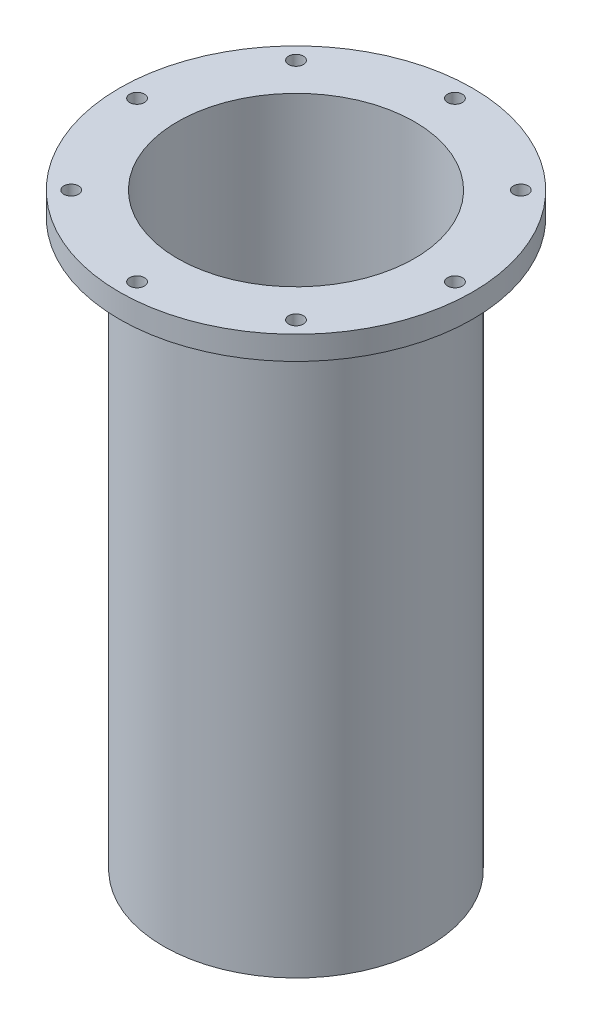
ISO-10303-21;
HEADER;
FILE_DESCRIPTION(('STEP AP214'),'2;1');
FILE_NAME('part.step','',(''),(''),'','','');
FILE_SCHEMA(('AUTOMOTIVE_DESIGN { 1 0 10303 214 1 1 1 1 }'));
ENDSEC;
DATA;
#1=APPLICATION_CONTEXT('core data for automotive mechanical design processes');
#2=APPLICATION_PROTOCOL_DEFINITION('international standard','automotive_design',2000,#1);
#3=PRODUCT_CONTEXT('',#1,'mechanical');
#4=PRODUCT('Part','Part','',(#3));
#5=PRODUCT_RELATED_PRODUCT_CATEGORY('part','',(#4));
#6=PRODUCT_DEFINITION_FORMATION('','',#4);
#7=PRODUCT_DEFINITION_CONTEXT('part definition',#1,'design');
#8=PRODUCT_DEFINITION('design','',#6,#7);
#9=PRODUCT_DEFINITION_SHAPE('','',#8);
#10=(LENGTH_UNIT() NAMED_UNIT(*) SI_UNIT(.MILLI.,.METRE.));
#11=(NAMED_UNIT(*) PLANE_ANGLE_UNIT() SI_UNIT($,.RADIAN.));
#12=(NAMED_UNIT(*) SI_UNIT($,.STERADIAN.) SOLID_ANGLE_UNIT());
#13=UNCERTAINTY_MEASURE_WITH_UNIT(LENGTH_MEASURE(1.E-05),#10,'distance_accuracy_value','');
#14=(GEOMETRIC_REPRESENTATION_CONTEXT(3) GLOBAL_UNCERTAINTY_ASSIGNED_CONTEXT((#13)) GLOBAL_UNIT_ASSIGNED_CONTEXT((#10,
#11,#12)) REPRESENTATION_CONTEXT('',''));
#15=CARTESIAN_POINT('',(0.,0.,0.));
#16=DIRECTION('',(0.,0.,1.));
#17=DIRECTION('',(1.,0.,0.));
#18=AXIS2_PLACEMENT_3D('',#15,#16,#17);
#19=CARTESIAN_POINT('',(51.1302,0.,0.));
#20=DIRECTION('',(0.,1.,0.));
#21=DIRECTION('',(0.,0.,1.));
#22=AXIS2_PLACEMENT_3D('',#19,#20,#21);
#23=PLANE('',#22);
#24=CARTESIAN_POINT('',(0.,0.,0.));
#25=DIRECTION('',(0.,1.,0.));
#26=DIRECTION('',(0.,0.,1.));
#27=AXIS2_PLACEMENT_3D('',#24,#25,#26);
#28=CIRCLE('',#27,57.15);
#29=CARTESIAN_POINT('',(0.,0.,57.15));
#30=VERTEX_POINT('',#29);
#31=EDGE_CURVE('E10',#30,#30,#28,.T.);
#32=ORIENTED_EDGE('',*,*,#31,.F.);
#33=EDGE_LOOP('',(#32));
#34=FACE_BOUND('',#33,.T.);
#35=CARTESIAN_POINT('',(0.,0.,0.));
#36=DIRECTION('',(0.,1.,0.));
#37=DIRECTION('',(0.,0.,1.));
#38=AXIS2_PLACEMENT_3D('',#35,#36,#37);
#39=CIRCLE('',#38,51.1302);
#40=CARTESIAN_POINT('',(0.,0.,51.1302));
#41=VERTEX_POINT('',#40);
#42=EDGE_CURVE('E58',#41,#41,#39,.T.);
#43=ORIENTED_EDGE('',*,*,#42,.T.);
#44=EDGE_LOOP('',(#43));
#45=FACE_BOUND('',#44,.T.);
#46=ADVANCED_FACE('F36',(#34,#45),#23,.F.);
#47=CARTESIAN_POINT('',(0.,0.,0.));
#48=DIRECTION('',(0.,1.,0.));
#49=DIRECTION('',(0.,0.,1.));
#50=AXIS2_PLACEMENT_3D('',#47,#48,#49);
#51=CYLINDRICAL_SURFACE('',#50,57.15);
#52=CARTESIAN_POINT('',(0.,243.84,0.));
#53=DIRECTION('',(0.,1.,0.));
#54=DIRECTION('',(0.,0.,1.));
#55=AXIS2_PLACEMENT_3D('',#52,#53,#54);
#56=CIRCLE('',#55,57.15);
#57=CARTESIAN_POINT('',(0.,243.84,57.15));
#58=VERTEX_POINT('',#57);
#59=EDGE_CURVE('E42',#58,#58,#56,.T.);
#60=ORIENTED_EDGE('',*,*,#59,.F.);
#61=EDGE_LOOP('',(#60));
#62=FACE_BOUND('',#61,.T.);
#63=ORIENTED_EDGE('',*,*,#31,.T.);
#64=EDGE_LOOP('',(#63));
#65=FACE_BOUND('',#64,.T.);
#66=ADVANCED_FACE('F144',(#62,#65),#51,.T.);
#67=CARTESIAN_POINT('',(57.15,243.84,0.));
#68=DIRECTION('',(0.,1.,0.));
#69=DIRECTION('',(0.,0.,1.));
#70=AXIS2_PLACEMENT_3D('',#67,#68,#69);
#71=PLANE('',#70);
#72=CARTESIAN_POINT('',(0.,243.84,-68.58));
#73=DIRECTION('',(0.,1.,0.));
#74=DIRECTION('',(0.,0.,1.));
#75=AXIS2_PLACEMENT_3D('',#72,#73,#74);
#76=CIRCLE('',#75,3.175);
#77=CARTESIAN_POINT('',(0.,243.84,-65.405));
#78=VERTEX_POINT('',#77);
#79=EDGE_CURVE('E61',#78,#78,#76,.T.);
#80=ORIENTED_EDGE('',*,*,#79,.T.);
#81=EDGE_LOOP('',(#80));
#82=FACE_BOUND('',#81,.T.);
#83=CARTESIAN_POINT('',(48.4933830537742,243.84,-48.4933830537727));
#84=DIRECTION('',(0.,1.,0.));
#85=DIRECTION('',(0.,0.,1.));
#86=AXIS2_PLACEMENT_3D('',#83,#84,#85);
#87=CIRCLE('',#86,3.17500000000001);
#88=CARTESIAN_POINT('',(48.4933830537742,243.84,-45.3183830537727));
#89=VERTEX_POINT('',#88);
#90=EDGE_CURVE('E64',#89,#89,#87,.T.);
#91=ORIENTED_EDGE('',*,*,#90,.T.);
#92=EDGE_LOOP('',(#91));
#93=FACE_BOUND('',#92,.T.);
#94=CARTESIAN_POINT('',(68.58,243.84,1.1518563880486E-12));
#95=DIRECTION('',(0.,1.,0.));
#96=DIRECTION('',(0.,0.,1.));
#97=AXIS2_PLACEMENT_3D('',#94,#95,#96);
#98=CIRCLE('',#97,3.17500000000001);
#99=CARTESIAN_POINT('',(68.58,243.84,3.17500000000116));
#100=VERTEX_POINT('',#99);
#101=EDGE_CURVE('E67',#100,#100,#98,.T.);
#102=ORIENTED_EDGE('',*,*,#101,.T.);
#103=EDGE_LOOP('',(#102));
#104=FACE_BOUND('',#103,.T.);
#105=CARTESIAN_POINT('',(48.4933830537725,243.84,48.4933830537744));
#106=DIRECTION('',(0.,1.,0.));
#107=DIRECTION('',(0.,0.,1.));
#108=AXIS2_PLACEMENT_3D('',#105,#106,#107);
#109=CIRCLE('',#108,3.175);
#110=CARTESIAN_POINT('',(48.4933830537725,243.84,51.6683830537744));
#111=VERTEX_POINT('',#110);
#112=EDGE_CURVE('E70',#111,#111,#109,.T.);
#113=ORIENTED_EDGE('',*,*,#112,.T.);
#114=EDGE_LOOP('',(#113));
#115=FACE_BOUND('',#114,.T.);
#116=CARTESIAN_POINT('',(-1.39471767468535E-12,243.84,68.58));
#117=DIRECTION('',(0.,1.,0.));
#118=DIRECTION('',(0.,0.,1.));
#119=AXIS2_PLACEMENT_3D('',#116,#117,#118);
#120=CIRCLE('',#119,3.17499999999999);
#121=CARTESIAN_POINT('',(-1.39471767468535E-12,243.84,71.755));
#122=VERTEX_POINT('',#121);
#123=EDGE_CURVE('E73',#122,#122,#120,.T.);
#124=ORIENTED_EDGE('',*,*,#123,.T.);
#125=EDGE_LOOP('',(#124));
#126=FACE_BOUND('',#125,.T.);
#127=CARTESIAN_POINT('',(-48.4933830537738,243.84,48.493383053773));
#128=DIRECTION('',(0.,1.,0.));
#129=DIRECTION('',(0.,0.,1.));
#130=AXIS2_PLACEMENT_3D('',#127,#128,#129);
#131=CIRCLE('',#130,3.17499999999999);
#132=CARTESIAN_POINT('',(-48.4933830537738,243.84,51.668383053773));
#133=VERTEX_POINT('',#132);
#134=EDGE_CURVE('E76',#133,#133,#131,.T.);
#135=ORIENTED_EDGE('',*,*,#134,.T.);
#136=EDGE_LOOP('',(#135));
#137=FACE_BOUND('',#136,.T.);
#138=CARTESIAN_POINT('',(-68.58,243.84,-6.93889390390723E-13));
#139=DIRECTION('',(0.,1.,0.));
#140=DIRECTION('',(0.,0.,1.));
#141=AXIS2_PLACEMENT_3D('',#138,#139,#140);
#142=CIRCLE('',#141,3.175);
#143=CARTESIAN_POINT('',(-68.58,243.84,3.17499999999931));
#144=VERTEX_POINT('',#143);
#145=EDGE_CURVE('E79',#144,#144,#142,.T.);
#146=ORIENTED_EDGE('',*,*,#145,.T.);
#147=EDGE_LOOP('',(#146));
#148=FACE_BOUND('',#147,.T.);
#149=CARTESIAN_POINT('',(-48.4933830537728,243.84,-48.493383053774));
#150=DIRECTION('',(0.,1.,0.));
#151=DIRECTION('',(0.,0.,1.));
#152=AXIS2_PLACEMENT_3D('',#149,#150,#151);
#153=CIRCLE('',#152,3.17499999999999);
#154=CARTESIAN_POINT('',(-48.4933830537728,243.84,-45.318383053774));
#155=VERTEX_POINT('',#154);
#156=EDGE_CURVE('E82',#155,#155,#153,.T.);
#157=ORIENTED_EDGE('',*,*,#156,.T.);
#158=EDGE_LOOP('',(#157));
#159=FACE_BOUND('',#158,.T.);
#160=CARTESIAN_POINT('',(0.,243.84,0.));
#161=DIRECTION('',(0.,1.,0.));
#162=DIRECTION('',(0.,0.,1.));
#163=AXIS2_PLACEMENT_3D('',#160,#161,#162);
#164=CIRCLE('',#163,76.2);
#165=CARTESIAN_POINT('',(0.,243.84,76.2));
#166=VERTEX_POINT('',#165);
#167=EDGE_CURVE('E46',#166,#166,#164,.T.);
#168=ORIENTED_EDGE('',*,*,#167,.F.);
#169=EDGE_LOOP('',(#168));
#170=FACE_BOUND('',#169,.T.);
#171=ORIENTED_EDGE('',*,*,#59,.T.);
#172=EDGE_LOOP('',(#171));
#173=FACE_BOUND('',#172,.T.);
#174=ADVANCED_FACE('F139',(#82,#93,#104,#115,#126,#137,#148,#159,#170,#173),#71,.F.);
#175=CARTESIAN_POINT('',(0.,0.,0.));
#176=DIRECTION('',(0.,1.,0.));
#177=DIRECTION('',(0.,0.,1.));
#178=AXIS2_PLACEMENT_3D('',#175,#176,#177);
#179=CYLINDRICAL_SURFACE('',#178,76.2);
#180=CARTESIAN_POINT('',(0.,254.,0.));
#181=DIRECTION('',(0.,1.,0.));
#182=DIRECTION('',(0.,0.,1.));
#183=AXIS2_PLACEMENT_3D('',#180,#181,#182);
#184=CIRCLE('',#183,76.2);
#185=CARTESIAN_POINT('',(0.,254.,76.2));
#186=VERTEX_POINT('',#185);
#187=EDGE_CURVE('E50',#186,#186,#184,.T.);
#188=ORIENTED_EDGE('',*,*,#187,.F.);
#189=EDGE_LOOP('',(#188));
#190=FACE_BOUND('',#189,.T.);
#191=ORIENTED_EDGE('',*,*,#167,.T.);
#192=EDGE_LOOP('',(#191));
#193=FACE_BOUND('',#192,.T.);
#194=ADVANCED_FACE('F117',(#190,#193),#179,.T.);
#195=CARTESIAN_POINT('',(76.2,254.,0.));
#196=DIRECTION('',(0.,-1.,0.));
#197=DIRECTION('',(0.,0.,-1.));
#198=AXIS2_PLACEMENT_3D('',#195,#196,#197);
#199=PLANE('',#198);
#200=CARTESIAN_POINT('',(0.,254.,-68.58));
#201=DIRECTION('',(0.,1.,0.));
#202=DIRECTION('',(0.,0.,1.));
#203=AXIS2_PLACEMENT_3D('',#200,#201,#202);
#204=CIRCLE('',#203,3.175);
#205=CARTESIAN_POINT('',(0.,254.,-65.405));
#206=VERTEX_POINT('',#205);
#207=EDGE_CURVE('E85',#206,#206,#204,.T.);
#208=ORIENTED_EDGE('',*,*,#207,.F.);
#209=EDGE_LOOP('',(#208));
#210=FACE_BOUND('',#209,.T.);
#211=CARTESIAN_POINT('',(48.4933830537742,254.,-48.4933830537727));
#212=DIRECTION('',(0.,1.,0.));
#213=DIRECTION('',(0.,0.,1.));
#214=AXIS2_PLACEMENT_3D('',#211,#212,#213);
#215=CIRCLE('',#214,3.17500000000001);
#216=CARTESIAN_POINT('',(48.4933830537742,254.,-45.3183830537727));
#217=VERTEX_POINT('',#216);
#218=EDGE_CURVE('E104',#217,#217,#215,.T.);
#219=ORIENTED_EDGE('',*,*,#218,.F.);
#220=EDGE_LOOP('',(#219));
#221=FACE_BOUND('',#220,.T.);
#222=CARTESIAN_POINT('',(68.58,254.,1.1518563880486E-12));
#223=DIRECTION('',(0.,1.,0.));
#224=DIRECTION('',(0.,0.,1.));
#225=AXIS2_PLACEMENT_3D('',#222,#223,#224);
#226=CIRCLE('',#225,3.17500000000001);
#227=CARTESIAN_POINT('',(68.58,254.,3.17500000000116));
#228=VERTEX_POINT('',#227);
#229=EDGE_CURVE('E101',#228,#228,#226,.T.);
#230=ORIENTED_EDGE('',*,*,#229,.F.);
#231=EDGE_LOOP('',(#230));
#232=FACE_BOUND('',#231,.T.);
#233=CARTESIAN_POINT('',(48.4933830537725,254.,48.4933830537744));
#234=DIRECTION('',(0.,1.,0.));
#235=DIRECTION('',(0.,0.,1.));
#236=AXIS2_PLACEMENT_3D('',#233,#234,#235);
#237=CIRCLE('',#236,3.175);
#238=CARTESIAN_POINT('',(48.4933830537725,254.,51.6683830537744));
#239=VERTEX_POINT('',#238);
#240=EDGE_CURVE('E98',#239,#239,#237,.T.);
#241=ORIENTED_EDGE('',*,*,#240,.F.);
#242=EDGE_LOOP('',(#241));
#243=FACE_BOUND('',#242,.T.);
#244=CARTESIAN_POINT('',(-1.39471767468535E-12,254.,68.58));
#245=DIRECTION('',(0.,1.,0.));
#246=DIRECTION('',(0.,0.,1.));
#247=AXIS2_PLACEMENT_3D('',#244,#245,#246);
#248=CIRCLE('',#247,3.17499999999999);
#249=CARTESIAN_POINT('',(-1.39471767468535E-12,254.,71.755));
#250=VERTEX_POINT('',#249);
#251=EDGE_CURVE('E95',#250,#250,#248,.T.);
#252=ORIENTED_EDGE('',*,*,#251,.F.);
#253=EDGE_LOOP('',(#252));
#254=FACE_BOUND('',#253,.T.);
#255=CARTESIAN_POINT('',(-48.4933830537738,254.,48.493383053773));
#256=DIRECTION('',(0.,1.,0.));
#257=DIRECTION('',(0.,0.,1.));
#258=AXIS2_PLACEMENT_3D('',#255,#256,#257);
#259=CIRCLE('',#258,3.17499999999999);
#260=CARTESIAN_POINT('',(-48.4933830537738,254.,51.668383053773));
#261=VERTEX_POINT('',#260);
#262=EDGE_CURVE('E92',#261,#261,#259,.T.);
#263=ORIENTED_EDGE('',*,*,#262,.F.);
#264=EDGE_LOOP('',(#263));
#265=FACE_BOUND('',#264,.T.);
#266=CARTESIAN_POINT('',(-68.58,254.,-6.93889390390723E-13));
#267=DIRECTION('',(0.,1.,0.));
#268=DIRECTION('',(0.,0.,1.));
#269=AXIS2_PLACEMENT_3D('',#266,#267,#268);
#270=CIRCLE('',#269,3.175);
#271=CARTESIAN_POINT('',(-68.58,254.,3.17499999999931));
#272=VERTEX_POINT('',#271);
#273=EDGE_CURVE('E89',#272,#272,#270,.T.);
#274=ORIENTED_EDGE('',*,*,#273,.F.);
#275=EDGE_LOOP('',(#274));
#276=FACE_BOUND('',#275,.T.);
#277=CARTESIAN_POINT('',(-48.4933830537728,254.,-48.493383053774));
#278=DIRECTION('',(0.,1.,0.));
#279=DIRECTION('',(0.,0.,1.));
#280=AXIS2_PLACEMENT_3D('',#277,#278,#279);
#281=CIRCLE('',#280,3.17499999999999);
#282=CARTESIAN_POINT('',(-48.4933830537728,254.,-45.318383053774));
#283=VERTEX_POINT('',#282);
#284=EDGE_CURVE('E86',#283,#283,#281,.T.);
#285=ORIENTED_EDGE('',*,*,#284,.F.);
#286=EDGE_LOOP('',(#285));
#287=FACE_BOUND('',#286,.T.);
#288=CARTESIAN_POINT('',(0.,254.,0.));
#289=DIRECTION('',(0.,1.,0.));
#290=DIRECTION('',(0.,0.,1.));
#291=AXIS2_PLACEMENT_3D('',#288,#289,#290);
#292=CIRCLE('',#291,51.1302);
#293=CARTESIAN_POINT('',(0.,254.,51.1302));
#294=VERTEX_POINT('',#293);
#295=EDGE_CURVE('E55',#294,#294,#292,.T.);
#296=ORIENTED_EDGE('',*,*,#295,.F.);
#297=EDGE_LOOP('',(#296));
#298=FACE_BOUND('',#297,.T.);
#299=ORIENTED_EDGE('',*,*,#187,.T.);
#300=EDGE_LOOP('',(#299));
#301=FACE_BOUND('',#300,.T.);
#302=ADVANCED_FACE('F113',(#210,#221,#232,#243,#254,#265,#276,#287,#298,#301),#199,.F.);
#303=CARTESIAN_POINT('',(0.,0.,0.));
#304=DIRECTION('',(0.,1.,0.));
#305=DIRECTION('',(0.,0.,1.));
#306=AXIS2_PLACEMENT_3D('',#303,#304,#305);
#307=CYLINDRICAL_SURFACE('',#306,51.1302);
#308=ORIENTED_EDGE('',*,*,#42,.F.);
#309=EDGE_LOOP('',(#308));
#310=FACE_BOUND('',#309,.T.);
#311=ORIENTED_EDGE('',*,*,#295,.T.);
#312=EDGE_LOOP('',(#311));
#313=FACE_BOUND('',#312,.T.);
#314=ADVANCED_FACE('F116',(#310,#313),#307,.F.);
#315=CARTESIAN_POINT('',(-48.4933830537728,0.,-48.493383053774));
#316=DIRECTION('',(0.,1.,0.));
#317=DIRECTION('',(0.,0.,1.));
#318=AXIS2_PLACEMENT_3D('',#315,#316,#317);
#319=CYLINDRICAL_SURFACE('',#318,3.17499999999999);
#320=ORIENTED_EDGE('',*,*,#284,.T.);
#321=EDGE_LOOP('',(#320));
#322=FACE_BOUND('',#321,.T.);
#323=ORIENTED_EDGE('',*,*,#156,.F.);
#324=EDGE_LOOP('',(#323));
#325=FACE_BOUND('',#324,.T.);
#326=ADVANCED_FACE('F162',(#322,#325),#319,.F.);
#327=CARTESIAN_POINT('',(-68.58,0.,-6.93889390390723E-13));
#328=DIRECTION('',(0.,1.,0.));
#329=DIRECTION('',(0.,0.,1.));
#330=AXIS2_PLACEMENT_3D('',#327,#328,#329);
#331=CYLINDRICAL_SURFACE('',#330,3.175);
#332=ORIENTED_EDGE('',*,*,#273,.T.);
#333=EDGE_LOOP('',(#332));
#334=FACE_BOUND('',#333,.T.);
#335=ORIENTED_EDGE('',*,*,#145,.F.);
#336=EDGE_LOOP('',(#335));
#337=FACE_BOUND('',#336,.T.);
#338=ADVANCED_FACE('F167',(#334,#337),#331,.F.);
#339=CARTESIAN_POINT('',(-48.4933830537738,0.,48.493383053773));
#340=DIRECTION('',(0.,1.,0.));
#341=DIRECTION('',(0.,0.,1.));
#342=AXIS2_PLACEMENT_3D('',#339,#340,#341);
#343=CYLINDRICAL_SURFACE('',#342,3.17499999999999);
#344=ORIENTED_EDGE('',*,*,#262,.T.);
#345=EDGE_LOOP('',(#344));
#346=FACE_BOUND('',#345,.T.);
#347=ORIENTED_EDGE('',*,*,#134,.F.);
#348=EDGE_LOOP('',(#347));
#349=FACE_BOUND('',#348,.T.);
#350=ADVANCED_FACE('F173',(#346,#349),#343,.F.);
#351=CARTESIAN_POINT('',(-1.39471767468535E-12,0.,68.58));
#352=DIRECTION('',(0.,1.,0.));
#353=DIRECTION('',(0.,0.,1.));
#354=AXIS2_PLACEMENT_3D('',#351,#352,#353);
#355=CYLINDRICAL_SURFACE('',#354,3.17499999999999);
#356=ORIENTED_EDGE('',*,*,#251,.T.);
#357=EDGE_LOOP('',(#356));
#358=FACE_BOUND('',#357,.T.);
#359=ORIENTED_EDGE('',*,*,#123,.F.);
#360=EDGE_LOOP('',(#359));
#361=FACE_BOUND('',#360,.T.);
#362=ADVANCED_FACE('F177',(#358,#361),#355,.F.);
#363=CARTESIAN_POINT('',(48.4933830537725,0.,48.4933830537744));
#364=DIRECTION('',(0.,1.,0.));
#365=DIRECTION('',(0.,0.,1.));
#366=AXIS2_PLACEMENT_3D('',#363,#364,#365);
#367=CYLINDRICAL_SURFACE('',#366,3.175);
#368=ORIENTED_EDGE('',*,*,#240,.T.);
#369=EDGE_LOOP('',(#368));
#370=FACE_BOUND('',#369,.T.);
#371=ORIENTED_EDGE('',*,*,#112,.F.);
#372=EDGE_LOOP('',(#371));
#373=FACE_BOUND('',#372,.T.);
#374=ADVANCED_FACE('F181',(#370,#373),#367,.F.);
#375=CARTESIAN_POINT('',(68.58,0.,1.1518563880486E-12));
#376=DIRECTION('',(0.,1.,0.));
#377=DIRECTION('',(0.,0.,1.));
#378=AXIS2_PLACEMENT_3D('',#375,#376,#377);
#379=CYLINDRICAL_SURFACE('',#378,3.17500000000001);
#380=ORIENTED_EDGE('',*,*,#229,.T.);
#381=EDGE_LOOP('',(#380));
#382=FACE_BOUND('',#381,.T.);
#383=ORIENTED_EDGE('',*,*,#101,.F.);
#384=EDGE_LOOP('',(#383));
#385=FACE_BOUND('',#384,.T.);
#386=ADVANCED_FACE('F185',(#382,#385),#379,.F.);
#387=CARTESIAN_POINT('',(48.4933830537742,0.,-48.4933830537727));
#388=DIRECTION('',(0.,1.,0.));
#389=DIRECTION('',(0.,0.,1.));
#390=AXIS2_PLACEMENT_3D('',#387,#388,#389);
#391=CYLINDRICAL_SURFACE('',#390,3.17500000000001);
#392=ORIENTED_EDGE('',*,*,#218,.T.);
#393=EDGE_LOOP('',(#392));
#394=FACE_BOUND('',#393,.T.);
#395=ORIENTED_EDGE('',*,*,#90,.F.);
#396=EDGE_LOOP('',(#395));
#397=FACE_BOUND('',#396,.T.);
#398=ADVANCED_FACE('F189',(#394,#397),#391,.F.);
#399=CARTESIAN_POINT('',(0.,0.,-68.58));
#400=DIRECTION('',(0.,1.,0.));
#401=DIRECTION('',(0.,0.,1.));
#402=AXIS2_PLACEMENT_3D('',#399,#400,#401);
#403=CYLINDRICAL_SURFACE('',#402,3.175);
#404=ORIENTED_EDGE('',*,*,#207,.T.);
#405=EDGE_LOOP('',(#404));
#406=FACE_BOUND('',#405,.T.);
#407=ORIENTED_EDGE('',*,*,#79,.F.);
#408=EDGE_LOOP('',(#407));
#409=FACE_BOUND('',#408,.T.);
#410=ADVANCED_FACE('F110',(#406,#409),#403,.F.);
#411=CLOSED_SHELL('',(#46,#66,#174,#194,#302,#314,#326,#338,#350,#362,#374,#386,#398,#410));
#412=MANIFOLD_SOLID_BREP('B2',#411);
#413=ADVANCED_BREP_SHAPE_REPRESENTATION('',(#18,#412),#14);
#414=SHAPE_DEFINITION_REPRESENTATION(#9,#413);
ENDSEC;
END-ISO-10303-21;
